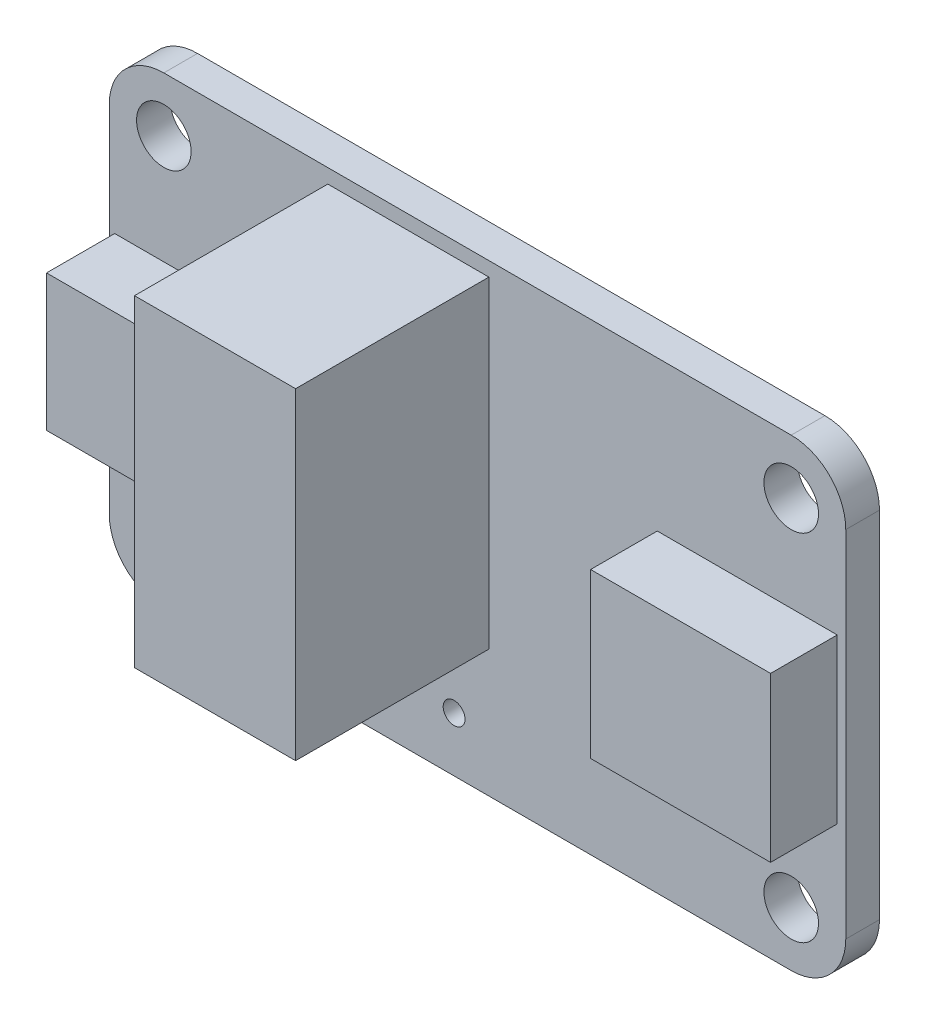
ISO-10303-21;
HEADER;
FILE_DESCRIPTION(('STEP AP214'),'2;1');
FILE_NAME('part.step','',(''),(''),'','','');
FILE_SCHEMA(('AUTOMOTIVE_DESIGN { 1 0 10303 214 1 1 1 1 }'));
ENDSEC;
DATA;
#1=APPLICATION_CONTEXT('core data for automotive mechanical design processes');
#2=APPLICATION_PROTOCOL_DEFINITION('international standard','automotive_design',2000,#1);
#3=PRODUCT_CONTEXT('',#1,'mechanical');
#4=PRODUCT('Part','Part','',(#3));
#5=PRODUCT_RELATED_PRODUCT_CATEGORY('part','',(#4));
#6=PRODUCT_DEFINITION_FORMATION('','',#4);
#7=PRODUCT_DEFINITION_CONTEXT('part definition',#1,'design');
#8=PRODUCT_DEFINITION('design','',#6,#7);
#9=PRODUCT_DEFINITION_SHAPE('','',#8);
#10=(LENGTH_UNIT() NAMED_UNIT(*) SI_UNIT(.MILLI.,.METRE.));
#11=(NAMED_UNIT(*) PLANE_ANGLE_UNIT() SI_UNIT($,.RADIAN.));
#12=(NAMED_UNIT(*) SI_UNIT($,.STERADIAN.) SOLID_ANGLE_UNIT());
#13=UNCERTAINTY_MEASURE_WITH_UNIT(LENGTH_MEASURE(1.E-05),#10,'distance_accuracy_value','');
#14=(GEOMETRIC_REPRESENTATION_CONTEXT(3) GLOBAL_UNCERTAINTY_ASSIGNED_CONTEXT((#13)) GLOBAL_UNIT_ASSIGNED_CONTEXT((#10,
#11,#12)) REPRESENTATION_CONTEXT('',''));
#15=CARTESIAN_POINT('',(0.,0.,0.));
#16=DIRECTION('',(0.,0.,1.));
#17=DIRECTION('',(1.,0.,0.));
#18=AXIS2_PLACEMENT_3D('',#15,#16,#17);
#19=CARTESIAN_POINT('',(0.,0.,1.5699994));
#20=DIRECTION('',(0.,0.,-1.));
#21=DIRECTION('',(-1.,0.,0.));
#22=AXIS2_PLACEMENT_3D('',#19,#20,#21);
#23=PLANE('',#22);
#24=DIRECTION('',(0.,1.,0.));
#25=VECTOR('',#24,1.);
#26=CARTESIAN_POINT('',(-12.192,3.175,1.5699994));
#27=LINE('',#26,#25);
#28=CARTESIAN_POINT('',(-12.192,-3.175,1.5699994));
#29=VERTEX_POINT('',#28);
#30=CARTESIAN_POINT('',(-12.192,3.175,1.5699994));
#31=VERTEX_POINT('',#30);
#32=EDGE_CURVE('E270',#29,#31,#27,.T.);
#33=ORIENTED_EDGE('',*,*,#32,.F.);
#34=DIRECTION('',(1.,0.,0.));
#35=VECTOR('',#34,1.);
#36=CARTESIAN_POINT('',(-16.891,-3.175,1.5699994));
#37=LINE('',#36,#35);
#38=CARTESIAN_POINT('',(-16.891,-3.175,1.5699994));
#39=VERTEX_POINT('',#38);
#40=EDGE_CURVE('E284',#39,#29,#37,.T.);
#41=ORIENTED_EDGE('',*,*,#40,.F.);
#42=DIRECTION('',(0.,-1.,0.));
#43=VECTOR('',#42,1.);
#44=CARTESIAN_POINT('',(-16.891,3.175,1.5699994));
#45=LINE('',#44,#43);
#46=CARTESIAN_POINT('',(-16.891,3.175,1.5699994));
#47=VERTEX_POINT('',#46);
#48=EDGE_CURVE('E301',#47,#39,#45,.T.);
#49=ORIENTED_EDGE('',*,*,#48,.F.);
#50=DIRECTION('',(-1.,0.,0.));
#51=VECTOR('',#50,1.);
#52=CARTESIAN_POINT('',(-16.891,3.175,1.5699994));
#53=LINE('',#52,#51);
#54=EDGE_CURVE('E297',#31,#47,#53,.T.);
#55=ORIENTED_EDGE('',*,*,#54,.F.);
#56=EDGE_LOOP('',(#33,#41,#49,#55));
#57=FACE_BOUND('',#56,.T.);
#58=CARTESIAN_POINT('',(-1.08979169383857,-8.255,1.5699994));
#59=DIRECTION('',(0.,0.,1.));
#60=DIRECTION('',(1.,0.,0.));
#61=AXIS2_PLACEMENT_3D('',#58,#59,#60);
#62=CIRCLE('',#61,0.508);
#63=CARTESIAN_POINT('',(-0.58179169383857,-8.255,1.5699994));
#64=VERTEX_POINT('',#63);
#65=EDGE_CURVE('E369',#64,#64,#62,.T.);
#66=ORIENTED_EDGE('',*,*,#65,.F.);
#67=EDGE_LOOP('',(#66));
#68=FACE_BOUND('',#67,.T.);
#69=CARTESIAN_POINT('',(-3.62979169383857,-8.255,1.5699994));
#70=DIRECTION('',(0.,0.,1.));
#71=DIRECTION('',(1.,0.,0.));
#72=AXIS2_PLACEMENT_3D('',#69,#70,#71);
#73=CIRCLE('',#72,0.508);
#74=CARTESIAN_POINT('',(-3.12179169383857,-8.255,1.5699994));
#75=VERTEX_POINT('',#74);
#76=EDGE_CURVE('E377',#75,#75,#73,.T.);
#77=ORIENTED_EDGE('',*,*,#76,.F.);
#78=EDGE_LOOP('',(#77));
#79=FACE_BOUND('',#78,.T.);
#80=CARTESIAN_POINT('',(-6.16979169383857,-8.255,1.5699994));
#81=DIRECTION('',(0.,0.,1.));
#82=DIRECTION('',(1.,0.,0.));
#83=AXIS2_PLACEMENT_3D('',#80,#81,#82);
#84=CIRCLE('',#83,0.508);
#85=CARTESIAN_POINT('',(-5.66179169383857,-8.255,1.5699994));
#86=VERTEX_POINT('',#85);
#87=EDGE_CURVE('E385',#86,#86,#84,.T.);
#88=ORIENTED_EDGE('',*,*,#87,.F.);
#89=EDGE_LOOP('',(#88));
#90=FACE_BOUND('',#89,.T.);
#91=CARTESIAN_POINT('',(14.605,8.255,1.5699994));
#92=DIRECTION('',(0.,0.,1.));
#93=DIRECTION('',(1.,0.,0.));
#94=AXIS2_PLACEMENT_3D('',#91,#92,#93);
#95=CIRCLE('',#94,1.27);
#96=CARTESIAN_POINT('',(15.875,8.255,1.5699994));
#97=VERTEX_POINT('',#96);
#98=EDGE_CURVE('E393',#97,#97,#95,.T.);
#99=ORIENTED_EDGE('',*,*,#98,.F.);
#100=EDGE_LOOP('',(#99));
#101=FACE_BOUND('',#100,.T.);
#102=CARTESIAN_POINT('',(14.605,-8.255,1.5699994));
#103=DIRECTION('',(0.,0.,1.));
#104=DIRECTION('',(1.,0.,0.));
#105=AXIS2_PLACEMENT_3D('',#102,#103,#104);
#106=CIRCLE('',#105,1.27);
#107=CARTESIAN_POINT('',(15.875,-8.255,1.5699994));
#108=VERTEX_POINT('',#107);
#109=EDGE_CURVE('E401',#108,#108,#106,.T.);
#110=ORIENTED_EDGE('',*,*,#109,.F.);
#111=EDGE_LOOP('',(#110));
#112=FACE_BOUND('',#111,.T.);
#113=CARTESIAN_POINT('',(-14.605,-8.255,1.5699994));
#114=DIRECTION('',(0.,0.,1.));
#115=DIRECTION('',(1.,0.,0.));
#116=AXIS2_PLACEMENT_3D('',#113,#114,#115);
#117=CIRCLE('',#116,1.27);
#118=CARTESIAN_POINT('',(-13.335,-8.255,1.5699994));
#119=VERTEX_POINT('',#118);
#120=EDGE_CURVE('E409',#119,#119,#117,.T.);
#121=ORIENTED_EDGE('',*,*,#120,.F.);
#122=EDGE_LOOP('',(#121));
#123=FACE_BOUND('',#122,.T.);
#124=CARTESIAN_POINT('',(-14.605,8.255,1.5699994));
#125=DIRECTION('',(0.,0.,1.));
#126=DIRECTION('',(1.,0.,0.));
#127=AXIS2_PLACEMENT_3D('',#124,#125,#126);
#128=CIRCLE('',#127,1.27);
#129=CARTESIAN_POINT('',(-13.335,8.255,1.5699994));
#130=VERTEX_POINT('',#129);
#131=EDGE_CURVE('E417',#130,#130,#128,.T.);
#132=ORIENTED_EDGE('',*,*,#131,.F.);
#133=EDGE_LOOP('',(#132));
#134=FACE_BOUND('',#133,.T.);
#135=DIRECTION('',(0.,1.,0.));
#136=VECTOR('',#135,1.);
#137=CARTESIAN_POINT('',(17.145,-10.795,1.5699994));
#138=LINE('',#137,#136);
#139=CARTESIAN_POINT('',(17.145,-8.255,1.5699994));
#140=VERTEX_POINT('',#139);
#141=CARTESIAN_POINT('',(17.145,8.255,1.5699994));
#142=VERTEX_POINT('',#141);
#143=EDGE_CURVE('E425',#140,#142,#138,.T.);
#144=ORIENTED_EDGE('',*,*,#143,.T.);
#145=CARTESIAN_POINT('',(14.605,8.255,1.5699994));
#146=DIRECTION('',(0.,0.,-1.));
#147=DIRECTION('',(-1.,0.,0.));
#148=AXIS2_PLACEMENT_3D('',#145,#146,#147);
#149=CIRCLE('',#148,2.54);
#150=CARTESIAN_POINT('',(14.605,10.795,1.5699994));
#151=VERTEX_POINT('',#150);
#152=EDGE_CURVE('E491',#142,#151,#149,.F.);
#153=ORIENTED_EDGE('',*,*,#152,.T.);
#154=DIRECTION('',(-1.,0.,0.));
#155=VECTOR('',#154,1.);
#156=CARTESIAN_POINT('',(-17.145,10.795,1.5699994));
#157=LINE('',#156,#155);
#158=CARTESIAN_POINT('',(-14.605,10.795,1.5699994));
#159=VERTEX_POINT('',#158);
#160=EDGE_CURVE('E429',#151,#159,#157,.T.);
#161=ORIENTED_EDGE('',*,*,#160,.T.);
#162=CARTESIAN_POINT('',(-14.605,8.255,1.5699994));
#163=DIRECTION('',(0.,0.,-1.));
#164=DIRECTION('',(-1.,0.,0.));
#165=AXIS2_PLACEMENT_3D('',#162,#163,#164);
#166=CIRCLE('',#165,2.54);
#167=CARTESIAN_POINT('',(-17.145,8.255,1.5699994));
#168=VERTEX_POINT('',#167);
#169=EDGE_CURVE('E482',#159,#168,#166,.F.);
#170=ORIENTED_EDGE('',*,*,#169,.T.);
#171=DIRECTION('',(0.,-1.,0.));
#172=VECTOR('',#171,1.);
#173=CARTESIAN_POINT('',(-17.145,-10.795,1.5699994));
#174=LINE('',#173,#172);
#175=CARTESIAN_POINT('',(-17.145,-8.255,1.5699994));
#176=VERTEX_POINT('',#175);
#177=EDGE_CURVE('E434',#168,#176,#174,.T.);
#178=ORIENTED_EDGE('',*,*,#177,.T.);
#179=CARTESIAN_POINT('',(-14.605,-8.255,1.5699994));
#180=DIRECTION('',(0.,0.,-1.));
#181=DIRECTION('',(-1.,0.,0.));
#182=AXIS2_PLACEMENT_3D('',#179,#180,#181);
#183=CIRCLE('',#182,2.54);
#184=CARTESIAN_POINT('',(-14.605,-10.795,1.5699994));
#185=VERTEX_POINT('',#184);
#186=EDGE_CURVE('E485',#176,#185,#183,.F.);
#187=ORIENTED_EDGE('',*,*,#186,.T.);
#188=DIRECTION('',(1.,0.,0.));
#189=VECTOR('',#188,1.);
#190=CARTESIAN_POINT('',(-17.145,-10.795,1.5699994));
#191=LINE('',#190,#189);
#192=CARTESIAN_POINT('',(14.605,-10.795,1.5699994));
#193=VERTEX_POINT('',#192);
#194=EDGE_CURVE('E438',#185,#193,#191,.T.);
#195=ORIENTED_EDGE('',*,*,#194,.T.);
#196=CARTESIAN_POINT('',(14.605,-8.255,1.5699994));
#197=DIRECTION('',(0.,0.,-1.));
#198=DIRECTION('',(-1.,0.,0.));
#199=AXIS2_PLACEMENT_3D('',#196,#197,#198);
#200=CIRCLE('',#199,2.54);
#201=EDGE_CURVE('E488',#193,#140,#200,.F.);
#202=ORIENTED_EDGE('',*,*,#201,.T.);
#203=EDGE_LOOP('',(#144,#153,#161,#170,#178,#187,#195,#202));
#204=FACE_BOUND('',#203,.T.);
#205=DIRECTION('',(0.,1.,0.));
#206=VECTOR('',#205,1.);
#207=CARTESIAN_POINT('',(0.530301049091974,10.1297954286495,1.5699994));
#208=LINE('',#207,#206);
#209=CARTESIAN_POINT('',(0.530301049091976,-4.87020457135051,1.5699994));
#210=VERTEX_POINT('',#209);
#211=CARTESIAN_POINT('',(0.530301049091974,10.1297954286495,1.5699994));
#212=VERTEX_POINT('',#211);
#213=EDGE_CURVE('E323',#210,#212,#208,.T.);
#214=ORIENTED_EDGE('',*,*,#213,.F.);
#215=DIRECTION('',(1.,0.,0.));
#216=VECTOR('',#215,1.);
#217=CARTESIAN_POINT('',(-6.96969895090802,-4.87020457135051,1.5699994));
#218=LINE('',#217,#216);
#219=CARTESIAN_POINT('',(-6.96969895090802,-4.87020457135051,1.5699994));
#220=VERTEX_POINT('',#219);
#221=EDGE_CURVE('E329',#220,#210,#218,.T.);
#222=ORIENTED_EDGE('',*,*,#221,.F.);
#223=DIRECTION('',(0.,-1.,0.));
#224=VECTOR('',#223,1.);
#225=CARTESIAN_POINT('',(-6.96969895090803,10.1297954286495,1.5699994));
#226=LINE('',#225,#224);
#227=CARTESIAN_POINT('',(-6.96969895090803,10.1297954286495,1.5699994));
#228=VERTEX_POINT('',#227);
#229=EDGE_CURVE('E346',#228,#220,#226,.T.);
#230=ORIENTED_EDGE('',*,*,#229,.F.);
#231=DIRECTION('',(-1.,0.,0.));
#232=VECTOR('',#231,1.);
#233=CARTESIAN_POINT('',(-6.96969895090803,10.1297954286495,1.5699994));
#234=LINE('',#233,#232);
#235=EDGE_CURVE('E342',#212,#228,#234,.T.);
#236=ORIENTED_EDGE('',*,*,#235,.F.);
#237=EDGE_LOOP('',(#214,#222,#230,#236));
#238=FACE_BOUND('',#237,.T.);
#239=DIRECTION('',(-1.,0.,0.));
#240=VECTOR('',#239,1.);
#241=CARTESIAN_POINT('',(8.36863494105447,3.81,1.5699994));
#242=LINE('',#241,#240);
#243=CARTESIAN_POINT('',(16.7473828153627,3.81,1.5699994));
#244=VERTEX_POINT('',#243);
#245=CARTESIAN_POINT('',(8.36863494105447,3.81,1.5699994));
#246=VERTEX_POINT('',#245);
#247=EDGE_CURVE('E222',#244,#246,#242,.T.);
#248=ORIENTED_EDGE('',*,*,#247,.F.);
#249=DIRECTION('',(0.,-1.,0.));
#250=VECTOR('',#249,1.);
#251=CARTESIAN_POINT('',(16.7473828153627,3.81,1.5699994));
#252=LINE('',#251,#250);
#253=CARTESIAN_POINT('',(16.7473828153627,-3.81,1.5699994));
#254=VERTEX_POINT('',#253);
#255=EDGE_CURVE('E235',#244,#254,#252,.T.);
#256=ORIENTED_EDGE('',*,*,#255,.T.);
#257=DIRECTION('',(-1.,0.,0.));
#258=VECTOR('',#257,1.);
#259=CARTESIAN_POINT('',(8.36863494105447,-3.81,1.5699994));
#260=LINE('',#259,#258);
#261=CARTESIAN_POINT('',(8.36863494105447,-3.81,1.5699994));
#262=VERTEX_POINT('',#261);
#263=EDGE_CURVE('E226',#254,#262,#260,.T.);
#264=ORIENTED_EDGE('',*,*,#263,.T.);
#265=DIRECTION('',(0.,-1.,0.));
#266=VECTOR('',#265,1.);
#267=CARTESIAN_POINT('',(8.36863494105447,3.81,1.5699994));
#268=LINE('',#267,#266);
#269=EDGE_CURVE('E1001',#246,#262,#268,.T.);
#270=ORIENTED_EDGE('',*,*,#269,.F.);
#271=EDGE_LOOP('',(#248,#256,#264,#270));
#272=FACE_BOUND('',#271,.T.);
#273=ADVANCED_FACE('F44',(#57,#68,#79,#90,#101,#112,#123,#134,#204,#238,#272),#23,.F.);
#274=CARTESIAN_POINT('',(0.,0.,0.));
#275=DIRECTION('',(0.,0.,-1.));
#276=DIRECTION('',(-1.,0.,0.));
#277=AXIS2_PLACEMENT_3D('',#274,#275,#276);
#278=PLANE('',#277);
#279=CARTESIAN_POINT('',(-3.62979169383857,-8.255,0.));
#280=DIRECTION('',(0.,0.,1.));
#281=DIRECTION('',(1.,0.,0.));
#282=AXIS2_PLACEMENT_3D('',#279,#280,#281);
#283=CIRCLE('',#282,0.508);
#284=CARTESIAN_POINT('',(-3.12179169383857,-8.255,0.));
#285=VERTEX_POINT('',#284);
#286=EDGE_CURVE('E373',#285,#285,#283,.T.);
#287=ORIENTED_EDGE('',*,*,#286,.T.);
#288=EDGE_LOOP('',(#287));
#289=FACE_BOUND('',#288,.T.);
#290=CARTESIAN_POINT('',(14.605,8.255,0.));
#291=DIRECTION('',(0.,0.,1.));
#292=DIRECTION('',(1.,0.,0.));
#293=AXIS2_PLACEMENT_3D('',#290,#291,#292);
#294=CIRCLE('',#293,1.27);
#295=CARTESIAN_POINT('',(15.875,8.255,0.));
#296=VERTEX_POINT('',#295);
#297=EDGE_CURVE('E389',#296,#296,#294,.T.);
#298=ORIENTED_EDGE('',*,*,#297,.T.);
#299=EDGE_LOOP('',(#298));
#300=FACE_BOUND('',#299,.T.);
#301=CARTESIAN_POINT('',(-14.605,-8.255,0.));
#302=DIRECTION('',(0.,0.,1.));
#303=DIRECTION('',(1.,0.,0.));
#304=AXIS2_PLACEMENT_3D('',#301,#302,#303);
#305=CIRCLE('',#304,1.27);
#306=CARTESIAN_POINT('',(-13.335,-8.255,0.));
#307=VERTEX_POINT('',#306);
#308=EDGE_CURVE('E405',#307,#307,#305,.T.);
#309=ORIENTED_EDGE('',*,*,#308,.T.);
#310=EDGE_LOOP('',(#309));
#311=FACE_BOUND('',#310,.T.);
#312=DIRECTION('',(-1.,0.,0.));
#313=VECTOR('',#312,1.);
#314=CARTESIAN_POINT('',(-17.145,10.795,0.));
#315=LINE('',#314,#313);
#316=CARTESIAN_POINT('',(14.605,10.795,0.));
#317=VERTEX_POINT('',#316);
#318=CARTESIAN_POINT('',(-14.605,10.795,0.));
#319=VERTEX_POINT('',#318);
#320=EDGE_CURVE('E446',#317,#319,#315,.T.);
#321=ORIENTED_EDGE('',*,*,#320,.F.);
#322=CARTESIAN_POINT('',(14.605,8.255,0.));
#323=DIRECTION('',(0.,0.,-1.));
#324=DIRECTION('',(-1.,0.,0.));
#325=AXIS2_PLACEMENT_3D('',#322,#323,#324);
#326=CIRCLE('',#325,2.54);
#327=CARTESIAN_POINT('',(17.145,8.255,0.));
#328=VERTEX_POINT('',#327);
#329=EDGE_CURVE('E472',#317,#328,#326,.T.);
#330=ORIENTED_EDGE('',*,*,#329,.T.);
#331=DIRECTION('',(0.,1.,0.));
#332=VECTOR('',#331,1.);
#333=CARTESIAN_POINT('',(17.145,-10.795,0.));
#334=LINE('',#333,#332);
#335=CARTESIAN_POINT('',(17.145,-8.255,0.));
#336=VERTEX_POINT('',#335);
#337=EDGE_CURVE('E421',#336,#328,#334,.T.);
#338=ORIENTED_EDGE('',*,*,#337,.F.);
#339=CARTESIAN_POINT('',(14.605,-8.255,0.));
#340=DIRECTION('',(0.,0.,-1.));
#341=DIRECTION('',(-1.,0.,0.));
#342=AXIS2_PLACEMENT_3D('',#339,#340,#341);
#343=CIRCLE('',#342,2.54);
#344=CARTESIAN_POINT('',(14.605,-10.795,0.));
#345=VERTEX_POINT('',#344);
#346=EDGE_CURVE('E469',#336,#345,#343,.T.);
#347=ORIENTED_EDGE('',*,*,#346,.T.);
#348=DIRECTION('',(1.,0.,0.));
#349=VECTOR('',#348,1.);
#350=CARTESIAN_POINT('',(-17.145,-10.795,0.));
#351=LINE('',#350,#349);
#352=CARTESIAN_POINT('',(-14.605,-10.795,0.));
#353=VERTEX_POINT('',#352);
#354=EDGE_CURVE('E430',#353,#345,#351,.T.);
#355=ORIENTED_EDGE('',*,*,#354,.F.);
#356=CARTESIAN_POINT('',(-14.605,-8.255,0.));
#357=DIRECTION('',(0.,0.,-1.));
#358=DIRECTION('',(-1.,0.,0.));
#359=AXIS2_PLACEMENT_3D('',#356,#357,#358);
#360=CIRCLE('',#359,2.54);
#361=CARTESIAN_POINT('',(-17.145,-8.255,0.));
#362=VERTEX_POINT('',#361);
#363=EDGE_CURVE('E466',#353,#362,#360,.T.);
#364=ORIENTED_EDGE('',*,*,#363,.T.);
#365=DIRECTION('',(0.,-1.,0.));
#366=VECTOR('',#365,1.);
#367=CARTESIAN_POINT('',(-17.145,-10.795,0.));
#368=LINE('',#367,#366);
#369=CARTESIAN_POINT('',(-17.145,8.255,0.));
#370=VERTEX_POINT('',#369);
#371=EDGE_CURVE('E450',#370,#362,#368,.T.);
#372=ORIENTED_EDGE('',*,*,#371,.F.);
#373=CARTESIAN_POINT('',(-14.605,8.255,0.));
#374=DIRECTION('',(0.,0.,-1.));
#375=DIRECTION('',(-1.,0.,0.));
#376=AXIS2_PLACEMENT_3D('',#373,#374,#375);
#377=CIRCLE('',#376,2.54);
#378=EDGE_CURVE('E463',#370,#319,#377,.T.);
#379=ORIENTED_EDGE('',*,*,#378,.T.);
#380=EDGE_LOOP('',(#321,#330,#338,#347,#355,#364,#372,#379));
#381=FACE_BOUND('',#380,.T.);
#382=CARTESIAN_POINT('',(-14.605,8.255,0.));
#383=DIRECTION('',(0.,0.,1.));
#384=DIRECTION('',(1.,0.,0.));
#385=AXIS2_PLACEMENT_3D('',#382,#383,#384);
#386=CIRCLE('',#385,1.27);
#387=CARTESIAN_POINT('',(-13.335,8.255,0.));
#388=VERTEX_POINT('',#387);
#389=EDGE_CURVE('E413',#388,#388,#386,.T.);
#390=ORIENTED_EDGE('',*,*,#389,.T.);
#391=EDGE_LOOP('',(#390));
#392=FACE_BOUND('',#391,.T.);
#393=CARTESIAN_POINT('',(14.605,-8.255,0.));
#394=DIRECTION('',(0.,0.,1.));
#395=DIRECTION('',(1.,0.,0.));
#396=AXIS2_PLACEMENT_3D('',#393,#394,#395);
#397=CIRCLE('',#396,1.27);
#398=CARTESIAN_POINT('',(15.875,-8.255,0.));
#399=VERTEX_POINT('',#398);
#400=EDGE_CURVE('E397',#399,#399,#397,.T.);
#401=ORIENTED_EDGE('',*,*,#400,.T.);
#402=EDGE_LOOP('',(#401));
#403=FACE_BOUND('',#402,.T.);
#404=CARTESIAN_POINT('',(-6.16979169383857,-8.255,0.));
#405=DIRECTION('',(0.,0.,1.));
#406=DIRECTION('',(1.,0.,0.));
#407=AXIS2_PLACEMENT_3D('',#404,#405,#406);
#408=CIRCLE('',#407,0.508);
#409=CARTESIAN_POINT('',(-5.66179169383857,-8.255,0.));
#410=VERTEX_POINT('',#409);
#411=EDGE_CURVE('E381',#410,#410,#408,.T.);
#412=ORIENTED_EDGE('',*,*,#411,.T.);
#413=EDGE_LOOP('',(#412));
#414=FACE_BOUND('',#413,.T.);
#415=CARTESIAN_POINT('',(-1.08979169383857,-8.255,0.));
#416=DIRECTION('',(0.,0.,1.));
#417=DIRECTION('',(1.,0.,0.));
#418=AXIS2_PLACEMENT_3D('',#415,#416,#417);
#419=CIRCLE('',#418,0.508);
#420=CARTESIAN_POINT('',(-0.58179169383857,-8.255,0.));
#421=VERTEX_POINT('',#420);
#422=EDGE_CURVE('E368',#421,#421,#419,.T.);
#423=ORIENTED_EDGE('',*,*,#422,.T.);
#424=EDGE_LOOP('',(#423));
#425=FACE_BOUND('',#424,.T.);
#426=ADVANCED_FACE('F512',(#289,#300,#311,#381,#392,#403,#414,#425),#278,.T.);
#427=CARTESIAN_POINT('',(17.145,-10.795,1.5699994));
#428=DIRECTION('',(-1.,0.,0.));
#429=DIRECTION('',(0.,0.,1.));
#430=AXIS2_PLACEMENT_3D('',#427,#428,#429);
#431=PLANE('',#430);
#432=ORIENTED_EDGE('',*,*,#337,.T.);
#433=DIRECTION('',(0.,0.,-1.));
#434=VECTOR('',#433,1.);
#435=CARTESIAN_POINT('',(17.145,8.255,1.5699994));
#436=LINE('',#435,#434);
#437=EDGE_CURVE('E479',#328,#142,#436,.F.);
#438=ORIENTED_EDGE('',*,*,#437,.T.);
#439=ORIENTED_EDGE('',*,*,#143,.F.);
#440=DIRECTION('',(0.,0.,-1.));
#441=VECTOR('',#440,1.);
#442=CARTESIAN_POINT('',(17.145,-8.255,1.5699994));
#443=LINE('',#442,#441);
#444=EDGE_CURVE('E475',#140,#336,#443,.T.);
#445=ORIENTED_EDGE('',*,*,#444,.T.);
#446=EDGE_LOOP('',(#432,#438,#439,#445));
#447=FACE_BOUND('',#446,.T.);
#448=ADVANCED_FACE('F532',(#447),#431,.F.);
#449=CARTESIAN_POINT('',(-17.145,10.795,1.5699994));
#450=DIRECTION('',(0.,-1.,0.));
#451=DIRECTION('',(0.,0.,-1.));
#452=AXIS2_PLACEMENT_3D('',#449,#450,#451);
#453=PLANE('',#452);
#454=ORIENTED_EDGE('',*,*,#160,.F.);
#455=DIRECTION('',(0.,0.,-1.));
#456=VECTOR('',#455,1.);
#457=CARTESIAN_POINT('',(14.605,10.795,1.5699994));
#458=LINE('',#457,#456);
#459=EDGE_CURVE('E459',#151,#317,#458,.T.);
#460=ORIENTED_EDGE('',*,*,#459,.T.);
#461=ORIENTED_EDGE('',*,*,#320,.T.);
#462=DIRECTION('',(0.,0.,-1.));
#463=VECTOR('',#462,1.);
#464=CARTESIAN_POINT('',(-14.605,10.795,1.5699994));
#465=LINE('',#464,#463);
#466=EDGE_CURVE('E442',#319,#159,#465,.F.);
#467=ORIENTED_EDGE('',*,*,#466,.T.);
#468=EDGE_LOOP('',(#454,#460,#461,#467));
#469=FACE_BOUND('',#468,.T.);
#470=ADVANCED_FACE('F540',(#469),#453,.F.);
#471=CARTESIAN_POINT('',(-17.145,-10.795,1.5699994));
#472=DIRECTION('',(1.,0.,0.));
#473=DIRECTION('',(0.,0.,-1.));
#474=AXIS2_PLACEMENT_3D('',#471,#472,#473);
#475=PLANE('',#474);
#476=ORIENTED_EDGE('',*,*,#371,.T.);
#477=DIRECTION('',(0.,0.,-1.));
#478=VECTOR('',#477,1.);
#479=CARTESIAN_POINT('',(-17.145,-8.255,1.5699994));
#480=LINE('',#479,#478);
#481=EDGE_CURVE('E11',#362,#176,#480,.F.);
#482=ORIENTED_EDGE('',*,*,#481,.T.);
#483=ORIENTED_EDGE('',*,*,#177,.F.);
#484=DIRECTION('',(0.,0.,-1.));
#485=VECTOR('',#484,1.);
#486=CARTESIAN_POINT('',(-17.145,8.255,1.5699994));
#487=LINE('',#486,#485);
#488=EDGE_CURVE('E53',#168,#370,#487,.T.);
#489=ORIENTED_EDGE('',*,*,#488,.T.);
#490=EDGE_LOOP('',(#476,#482,#483,#489));
#491=FACE_BOUND('',#490,.T.);
#492=ADVANCED_FACE('F506',(#491),#475,.F.);
#493=CARTESIAN_POINT('',(-17.145,-10.795,1.5699994));
#494=DIRECTION('',(0.,1.,0.));
#495=DIRECTION('',(0.,0.,1.));
#496=AXIS2_PLACEMENT_3D('',#493,#494,#495);
#497=PLANE('',#496);
#498=ORIENTED_EDGE('',*,*,#354,.T.);
#499=DIRECTION('',(0.,0.,-1.));
#500=VECTOR('',#499,1.);
#501=CARTESIAN_POINT('',(14.605,-10.795,1.5699994));
#502=LINE('',#501,#500);
#503=EDGE_CURVE('E498',#345,#193,#502,.F.);
#504=ORIENTED_EDGE('',*,*,#503,.T.);
#505=ORIENTED_EDGE('',*,*,#194,.F.);
#506=DIRECTION('',(0.,0.,-1.));
#507=VECTOR('',#506,1.);
#508=CARTESIAN_POINT('',(-14.605,-10.795,1.5699994));
#509=LINE('',#508,#507);
#510=EDGE_CURVE('E494',#185,#353,#509,.T.);
#511=ORIENTED_EDGE('',*,*,#510,.T.);
#512=EDGE_LOOP('',(#498,#504,#505,#511));
#513=FACE_BOUND('',#512,.T.);
#514=ADVANCED_FACE('F521',(#513),#497,.F.);
#515=CARTESIAN_POINT('',(-14.605,8.255,1.5699994));
#516=DIRECTION('',(0.,0.,-1.));
#517=DIRECTION('',(-1.,0.,0.));
#518=AXIS2_PLACEMENT_3D('',#515,#516,#517);
#519=CYLINDRICAL_SURFACE('',#518,1.27);
#520=ORIENTED_EDGE('',*,*,#131,.T.);
#521=EDGE_LOOP('',(#520));
#522=FACE_BOUND('',#521,.T.);
#523=ORIENTED_EDGE('',*,*,#389,.F.);
#524=EDGE_LOOP('',(#523));
#525=FACE_BOUND('',#524,.T.);
#526=ADVANCED_FACE('F561',(#522,#525),#519,.F.);
#527=CARTESIAN_POINT('',(-14.605,-8.255,1.5699994));
#528=DIRECTION('',(0.,0.,-1.));
#529=DIRECTION('',(-1.,0.,0.));
#530=AXIS2_PLACEMENT_3D('',#527,#528,#529);
#531=CYLINDRICAL_SURFACE('',#530,1.27);
#532=ORIENTED_EDGE('',*,*,#120,.T.);
#533=EDGE_LOOP('',(#532));
#534=FACE_BOUND('',#533,.T.);
#535=ORIENTED_EDGE('',*,*,#308,.F.);
#536=EDGE_LOOP('',(#535));
#537=FACE_BOUND('',#536,.T.);
#538=ADVANCED_FACE('F828',(#534,#537),#531,.F.);
#539=CARTESIAN_POINT('',(14.605,-8.255,1.5699994));
#540=DIRECTION('',(0.,0.,-1.));
#541=DIRECTION('',(-1.,0.,0.));
#542=AXIS2_PLACEMENT_3D('',#539,#540,#541);
#543=CYLINDRICAL_SURFACE('',#542,1.27);
#544=ORIENTED_EDGE('',*,*,#109,.T.);
#545=EDGE_LOOP('',(#544));
#546=FACE_BOUND('',#545,.T.);
#547=ORIENTED_EDGE('',*,*,#400,.F.);
#548=EDGE_LOOP('',(#547));
#549=FACE_BOUND('',#548,.T.);
#550=ADVANCED_FACE('F825',(#546,#549),#543,.F.);
#551=CARTESIAN_POINT('',(14.605,8.255,1.5699994));
#552=DIRECTION('',(0.,0.,-1.));
#553=DIRECTION('',(-1.,0.,0.));
#554=AXIS2_PLACEMENT_3D('',#551,#552,#553);
#555=CYLINDRICAL_SURFACE('',#554,1.27);
#556=ORIENTED_EDGE('',*,*,#98,.T.);
#557=EDGE_LOOP('',(#556));
#558=FACE_BOUND('',#557,.T.);
#559=ORIENTED_EDGE('',*,*,#297,.F.);
#560=EDGE_LOOP('',(#559));
#561=FACE_BOUND('',#560,.T.);
#562=ADVANCED_FACE('F821',(#558,#561),#555,.F.);
#563=CARTESIAN_POINT('',(-6.16979169383857,-8.255,1.5699994));
#564=DIRECTION('',(0.,0.,-1.));
#565=DIRECTION('',(-1.,0.,0.));
#566=AXIS2_PLACEMENT_3D('',#563,#564,#565);
#567=CYLINDRICAL_SURFACE('',#566,0.508);
#568=ORIENTED_EDGE('',*,*,#87,.T.);
#569=EDGE_LOOP('',(#568));
#570=FACE_BOUND('',#569,.T.);
#571=ORIENTED_EDGE('',*,*,#411,.F.);
#572=EDGE_LOOP('',(#571));
#573=FACE_BOUND('',#572,.T.);
#574=ADVANCED_FACE('F817',(#570,#573),#567,.F.);
#575=CARTESIAN_POINT('',(-3.62979169383857,-8.255,1.5699994));
#576=DIRECTION('',(0.,0.,-1.));
#577=DIRECTION('',(-1.,0.,0.));
#578=AXIS2_PLACEMENT_3D('',#575,#576,#577);
#579=CYLINDRICAL_SURFACE('',#578,0.508);
#580=ORIENTED_EDGE('',*,*,#76,.T.);
#581=EDGE_LOOP('',(#580));
#582=FACE_BOUND('',#581,.T.);
#583=ORIENTED_EDGE('',*,*,#286,.F.);
#584=EDGE_LOOP('',(#583));
#585=FACE_BOUND('',#584,.T.);
#586=ADVANCED_FACE('F813',(#582,#585),#579,.F.);
#587=CARTESIAN_POINT('',(-1.08979169383857,-8.255,1.5699994));
#588=DIRECTION('',(0.,0.,-1.));
#589=DIRECTION('',(-1.,0.,0.));
#590=AXIS2_PLACEMENT_3D('',#587,#588,#589);
#591=CYLINDRICAL_SURFACE('',#590,0.508);
#592=ORIENTED_EDGE('',*,*,#65,.T.);
#593=EDGE_LOOP('',(#592));
#594=FACE_BOUND('',#593,.T.);
#595=ORIENTED_EDGE('',*,*,#422,.F.);
#596=EDGE_LOOP('',(#595));
#597=FACE_BOUND('',#596,.T.);
#598=ADVANCED_FACE('F574',(#594,#597),#591,.F.);
#599=CARTESIAN_POINT('',(14.605,8.255,1.5699994));
#600=DIRECTION('',(0.,0.,-1.));
#601=DIRECTION('',(-1.,0.,0.));
#602=AXIS2_PLACEMENT_3D('',#599,#600,#601);
#603=CYLINDRICAL_SURFACE('',#602,2.54);
#604=ORIENTED_EDGE('',*,*,#152,.F.);
#605=ORIENTED_EDGE('',*,*,#437,.F.);
#606=ORIENTED_EDGE('',*,*,#329,.F.);
#607=ORIENTED_EDGE('',*,*,#459,.F.);
#608=EDGE_LOOP('',(#604,#605,#606,#607));
#609=FACE_BOUND('',#608,.T.);
#610=ADVANCED_FACE('F537',(#609),#603,.T.);
#611=CARTESIAN_POINT('',(14.605,-8.255,1.5699994));
#612=DIRECTION('',(0.,0.,-1.));
#613=DIRECTION('',(-1.,0.,0.));
#614=AXIS2_PLACEMENT_3D('',#611,#612,#613);
#615=CYLINDRICAL_SURFACE('',#614,2.54);
#616=ORIENTED_EDGE('',*,*,#201,.F.);
#617=ORIENTED_EDGE('',*,*,#503,.F.);
#618=ORIENTED_EDGE('',*,*,#346,.F.);
#619=ORIENTED_EDGE('',*,*,#444,.F.);
#620=EDGE_LOOP('',(#616,#617,#618,#619));
#621=FACE_BOUND('',#620,.T.);
#622=ADVANCED_FACE('F529',(#621),#615,.T.);
#623=CARTESIAN_POINT('',(-14.605,-8.255,1.5699994));
#624=DIRECTION('',(0.,0.,-1.));
#625=DIRECTION('',(-1.,0.,0.));
#626=AXIS2_PLACEMENT_3D('',#623,#624,#625);
#627=CYLINDRICAL_SURFACE('',#626,2.54);
#628=ORIENTED_EDGE('',*,*,#186,.F.);
#629=ORIENTED_EDGE('',*,*,#481,.F.);
#630=ORIENTED_EDGE('',*,*,#363,.F.);
#631=ORIENTED_EDGE('',*,*,#510,.F.);
#632=EDGE_LOOP('',(#628,#629,#630,#631));
#633=FACE_BOUND('',#632,.T.);
#634=ADVANCED_FACE('F518',(#633),#627,.T.);
#635=CARTESIAN_POINT('',(-14.605,8.255,1.5699994));
#636=DIRECTION('',(0.,0.,-1.));
#637=DIRECTION('',(-1.,0.,0.));
#638=AXIS2_PLACEMENT_3D('',#635,#636,#637);
#639=CYLINDRICAL_SURFACE('',#638,2.54);
#640=ORIENTED_EDGE('',*,*,#169,.F.);
#641=ORIENTED_EDGE('',*,*,#466,.F.);
#642=ORIENTED_EDGE('',*,*,#378,.F.);
#643=ORIENTED_EDGE('',*,*,#488,.F.);
#644=EDGE_LOOP('',(#640,#641,#642,#643));
#645=FACE_BOUND('',#644,.T.);
#646=ADVANCED_FACE('F46',(#645),#639,.T.);
#647=CARTESIAN_POINT('',(0.530301049091974,10.1297954286495,10.5699994));
#648=DIRECTION('',(-1.,0.,0.));
#649=DIRECTION('',(0.,-1.,0.));
#650=AXIS2_PLACEMENT_3D('',#647,#648,#649);
#651=PLANE('',#650);
#652=ORIENTED_EDGE('',*,*,#213,.T.);
#653=DIRECTION('',(0.,0.,-1.));
#654=VECTOR('',#653,1.);
#655=CARTESIAN_POINT('',(0.530301049091974,10.1297954286495,10.5699994));
#656=LINE('',#655,#654);
#657=CARTESIAN_POINT('',(0.530301049091974,10.1297954286495,10.5699994));
#658=VERTEX_POINT('',#657);
#659=EDGE_CURVE('E364',#658,#212,#656,.T.);
#660=ORIENTED_EDGE('',*,*,#659,.F.);
#661=DIRECTION('',(0.,1.,0.));
#662=VECTOR('',#661,1.);
#663=CARTESIAN_POINT('',(0.530301049091974,10.1297954286495,10.5699994));
#664=LINE('',#663,#662);
#665=CARTESIAN_POINT('',(0.530301049091976,-4.87020457135051,10.5699994));
#666=VERTEX_POINT('',#665);
#667=EDGE_CURVE('E324',#666,#658,#664,.T.);
#668=ORIENTED_EDGE('',*,*,#667,.F.);
#669=DIRECTION('',(0.,0.,-1.));
#670=VECTOR('',#669,1.);
#671=CARTESIAN_POINT('',(0.530301049091976,-4.87020457135051,10.5699994));
#672=LINE('',#671,#670);
#673=EDGE_CURVE('E338',#666,#210,#672,.T.);
#674=ORIENTED_EDGE('',*,*,#673,.T.);
#675=EDGE_LOOP('',(#652,#660,#668,#674));
#676=FACE_BOUND('',#675,.T.);
#677=ADVANCED_FACE('F543',(#676),#651,.F.);
#678=CARTESIAN_POINT('',(-6.96969895090803,10.1297954286495,10.5699994));
#679=DIRECTION('',(0.,-1.,0.));
#680=DIRECTION('',(0.,0.,-1.));
#681=AXIS2_PLACEMENT_3D('',#678,#679,#680);
#682=PLANE('',#681);
#683=ORIENTED_EDGE('',*,*,#235,.T.);
#684=DIRECTION('',(0.,0.,-1.));
#685=VECTOR('',#684,1.);
#686=CARTESIAN_POINT('',(-6.96969895090803,10.1297954286495,10.5699994));
#687=LINE('',#686,#685);
#688=CARTESIAN_POINT('',(-6.96969895090803,10.1297954286495,10.5699994));
#689=VERTEX_POINT('',#688);
#690=EDGE_CURVE('E360',#689,#228,#687,.T.);
#691=ORIENTED_EDGE('',*,*,#690,.F.);
#692=DIRECTION('',(-1.,0.,0.));
#693=VECTOR('',#692,1.);
#694=CARTESIAN_POINT('',(-6.96969895090803,10.1297954286495,10.5699994));
#695=LINE('',#694,#693);
#696=EDGE_CURVE('E328',#658,#689,#695,.T.);
#697=ORIENTED_EDGE('',*,*,#696,.F.);
#698=ORIENTED_EDGE('',*,*,#659,.T.);
#699=EDGE_LOOP('',(#683,#691,#697,#698));
#700=FACE_BOUND('',#699,.T.);
#701=ADVANCED_FACE('F548',(#700),#682,.F.);
#702=CARTESIAN_POINT('',(-6.96969895090803,10.1297954286495,10.5699994));
#703=DIRECTION('',(1.,0.,0.));
#704=DIRECTION('',(0.,1.,0.));
#705=AXIS2_PLACEMENT_3D('',#702,#703,#704);
#706=PLANE('',#705);
#707=ORIENTED_EDGE('',*,*,#229,.T.);
#708=DIRECTION('',(0.,0.,-1.));
#709=VECTOR('',#708,1.);
#710=CARTESIAN_POINT('',(-6.96969895090802,-4.87020457135051,10.5699994));
#711=LINE('',#710,#709);
#712=CARTESIAN_POINT('',(-6.96969895090802,-4.87020457135051,10.5699994));
#713=VERTEX_POINT('',#712);
#714=EDGE_CURVE('E356',#713,#220,#711,.T.);
#715=ORIENTED_EDGE('',*,*,#714,.F.);
#716=DIRECTION('',(0.,-1.,0.));
#717=VECTOR('',#716,1.);
#718=CARTESIAN_POINT('',(-6.96969895090803,10.1297954286495,10.5699994));
#719=LINE('',#718,#717);
#720=EDGE_CURVE('E332',#689,#713,#719,.T.);
#721=ORIENTED_EDGE('',*,*,#720,.F.);
#722=ORIENTED_EDGE('',*,*,#690,.T.);
#723=EDGE_LOOP('',(#707,#715,#721,#722));
#724=FACE_BOUND('',#723,.T.);
#725=ADVANCED_FACE('F607',(#724),#706,.F.);
#726=CARTESIAN_POINT('',(-6.96969895090802,-4.87020457135051,10.5699994));
#727=DIRECTION('',(0.,1.,0.));
#728=DIRECTION('',(0.,0.,1.));
#729=AXIS2_PLACEMENT_3D('',#726,#727,#728);
#730=PLANE('',#729);
#731=ORIENTED_EDGE('',*,*,#221,.T.);
#732=ORIENTED_EDGE('',*,*,#673,.F.);
#733=DIRECTION('',(1.,0.,0.));
#734=VECTOR('',#733,1.);
#735=CARTESIAN_POINT('',(-6.96969895090802,-4.87020457135051,10.5699994));
#736=LINE('',#735,#734);
#737=EDGE_CURVE('E335',#713,#666,#736,.T.);
#738=ORIENTED_EDGE('',*,*,#737,.F.);
#739=ORIENTED_EDGE('',*,*,#714,.T.);
#740=EDGE_LOOP('',(#731,#732,#738,#739));
#741=FACE_BOUND('',#740,.T.);
#742=ADVANCED_FACE('F618',(#741),#730,.F.);
#743=CARTESIAN_POINT('',(0.,0.,10.5699994));
#744=DIRECTION('',(0.,0.,1.));
#745=DIRECTION('',(1.,0.,0.));
#746=AXIS2_PLACEMENT_3D('',#743,#744,#745);
#747=PLANE('',#746);
#748=ORIENTED_EDGE('',*,*,#667,.T.);
#749=ORIENTED_EDGE('',*,*,#696,.T.);
#750=ORIENTED_EDGE('',*,*,#720,.T.);
#751=ORIENTED_EDGE('',*,*,#737,.T.);
#752=EDGE_LOOP('',(#748,#749,#750,#751));
#753=FACE_BOUND('',#752,.T.);
#754=ADVANCED_FACE('F629',(#753),#747,.T.);
#755=CARTESIAN_POINT('',(-12.192,3.175,4.7449994));
#756=DIRECTION('',(-1.,0.,0.));
#757=DIRECTION('',(0.,0.,1.));
#758=AXIS2_PLACEMENT_3D('',#755,#756,#757);
#759=PLANE('',#758);
#760=ORIENTED_EDGE('',*,*,#32,.T.);
#761=DIRECTION('',(0.,0.,-1.));
#762=VECTOR('',#761,1.);
#763=CARTESIAN_POINT('',(-12.192,3.175,4.7449994));
#764=LINE('',#763,#762);
#765=CARTESIAN_POINT('',(-12.192,3.175,4.7449994));
#766=VERTEX_POINT('',#765);
#767=EDGE_CURVE('E319',#766,#31,#764,.T.);
#768=ORIENTED_EDGE('',*,*,#767,.F.);
#769=DIRECTION('',(0.,1.,0.));
#770=VECTOR('',#769,1.);
#771=CARTESIAN_POINT('',(-12.192,3.175,4.7449994));
#772=LINE('',#771,#770);
#773=CARTESIAN_POINT('',(-12.192,-3.175,4.7449994));
#774=VERTEX_POINT('',#773);
#775=EDGE_CURVE('E279',#774,#766,#772,.T.);
#776=ORIENTED_EDGE('',*,*,#775,.F.);
#777=DIRECTION('',(0.,0.,-1.));
#778=VECTOR('',#777,1.);
#779=CARTESIAN_POINT('',(-12.192,-3.175,4.7449994));
#780=LINE('',#779,#778);
#781=EDGE_CURVE('E293',#774,#29,#780,.T.);
#782=ORIENTED_EDGE('',*,*,#781,.T.);
#783=EDGE_LOOP('',(#760,#768,#776,#782));
#784=FACE_BOUND('',#783,.T.);
#785=ADVANCED_FACE('F640',(#784),#759,.F.);
#786=CARTESIAN_POINT('',(-16.891,3.175,4.7449994));
#787=DIRECTION('',(0.,-1.,0.));
#788=DIRECTION('',(1.,0.,0.));
#789=AXIS2_PLACEMENT_3D('',#786,#787,#788);
#790=PLANE('',#789);
#791=ORIENTED_EDGE('',*,*,#54,.T.);
#792=DIRECTION('',(0.,0.,-1.));
#793=VECTOR('',#792,1.);
#794=CARTESIAN_POINT('',(-16.891,3.175,4.7449994));
#795=LINE('',#794,#793);
#796=CARTESIAN_POINT('',(-16.891,3.175,4.7449994));
#797=VERTEX_POINT('',#796);
#798=EDGE_CURVE('E315',#797,#47,#795,.T.);
#799=ORIENTED_EDGE('',*,*,#798,.F.);
#800=DIRECTION('',(-1.,0.,0.));
#801=VECTOR('',#800,1.);
#802=CARTESIAN_POINT('',(-16.891,3.175,4.7449994));
#803=LINE('',#802,#801);
#804=EDGE_CURVE('E283',#766,#797,#803,.T.);
#805=ORIENTED_EDGE('',*,*,#804,.F.);
#806=ORIENTED_EDGE('',*,*,#767,.T.);
#807=EDGE_LOOP('',(#791,#799,#805,#806));
#808=FACE_BOUND('',#807,.T.);
#809=ADVANCED_FACE('F651',(#808),#790,.F.);
#810=CARTESIAN_POINT('',(-16.891,3.175,4.7449994));
#811=DIRECTION('',(1.,0.,0.));
#812=DIRECTION('',(0.,0.,-1.));
#813=AXIS2_PLACEMENT_3D('',#810,#811,#812);
#814=PLANE('',#813);
#815=DIRECTION('',(0.,0.,-1.));
#816=VECTOR('',#815,1.);
#817=CARTESIAN_POINT('',(-16.891,2.921,1.8239994));
#818=LINE('',#817,#816);
#819=CARTESIAN_POINT('',(-16.891,2.921,4.4909994));
#820=VERTEX_POINT('',#819);
#821=CARTESIAN_POINT('',(-16.891,2.921,1.8239994));
#822=VERTEX_POINT('',#821);
#823=EDGE_CURVE('E233',#820,#822,#818,.T.);
#824=ORIENTED_EDGE('',*,*,#823,.F.);
#825=DIRECTION('',(0.,1.,0.));
#826=VECTOR('',#825,1.);
#827=CARTESIAN_POINT('',(-16.891,2.921,4.4909994));
#828=LINE('',#827,#826);
#829=CARTESIAN_POINT('',(-16.891,-2.921,4.4909994));
#830=VERTEX_POINT('',#829);
#831=EDGE_CURVE('E68',#830,#820,#828,.T.);
#832=ORIENTED_EDGE('',*,*,#831,.F.);
#833=DIRECTION('',(0.,0.,1.));
#834=VECTOR('',#833,1.);
#835=CARTESIAN_POINT('',(-16.891,-2.921,1.8239994));
#836=LINE('',#835,#834);
#837=CARTESIAN_POINT('',(-16.891,-2.921,1.8239994));
#838=VERTEX_POINT('',#837);
#839=EDGE_CURVE('E244',#838,#830,#836,.T.);
#840=ORIENTED_EDGE('',*,*,#839,.F.);
#841=DIRECTION('',(0.,-1.,0.));
#842=VECTOR('',#841,1.);
#843=CARTESIAN_POINT('',(-16.891,2.921,1.8239994));
#844=LINE('',#843,#842);
#845=EDGE_CURVE('E260',#822,#838,#844,.T.);
#846=ORIENTED_EDGE('',*,*,#845,.F.);
#847=EDGE_LOOP('',(#824,#832,#840,#846));
#848=FACE_BOUND('',#847,.T.);
#849=ORIENTED_EDGE('',*,*,#48,.T.);
#850=DIRECTION('',(0.,0.,-1.));
#851=VECTOR('',#850,1.);
#852=CARTESIAN_POINT('',(-16.891,-3.175,4.7449994));
#853=LINE('',#852,#851);
#854=CARTESIAN_POINT('',(-16.891,-3.175,4.7449994));
#855=VERTEX_POINT('',#854);
#856=EDGE_CURVE('E311',#855,#39,#853,.T.);
#857=ORIENTED_EDGE('',*,*,#856,.F.);
#858=DIRECTION('',(0.,-1.,0.));
#859=VECTOR('',#858,1.);
#860=CARTESIAN_POINT('',(-16.891,3.175,4.7449994));
#861=LINE('',#860,#859);
#862=EDGE_CURVE('E287',#797,#855,#861,.T.);
#863=ORIENTED_EDGE('',*,*,#862,.F.);
#864=ORIENTED_EDGE('',*,*,#798,.T.);
#865=EDGE_LOOP('',(#849,#857,#863,#864));
#866=FACE_BOUND('',#865,.T.);
#867=ADVANCED_FACE('F662',(#848,#866),#814,.F.);
#868=CARTESIAN_POINT('',(-16.891,-3.175,4.7449994));
#869=DIRECTION('',(0.,1.,0.));
#870=DIRECTION('',(-1.,0.,0.));
#871=AXIS2_PLACEMENT_3D('',#868,#869,#870);
#872=PLANE('',#871);
#873=ORIENTED_EDGE('',*,*,#40,.T.);
#874=ORIENTED_EDGE('',*,*,#781,.F.);
#875=DIRECTION('',(1.,0.,0.));
#876=VECTOR('',#875,1.);
#877=CARTESIAN_POINT('',(-16.891,-3.175,4.7449994));
#878=LINE('',#877,#876);
#879=EDGE_CURVE('E290',#855,#774,#878,.T.);
#880=ORIENTED_EDGE('',*,*,#879,.F.);
#881=ORIENTED_EDGE('',*,*,#856,.T.);
#882=EDGE_LOOP('',(#873,#874,#880,#881));
#883=FACE_BOUND('',#882,.T.);
#884=ADVANCED_FACE('F671',(#883),#872,.F.);
#885=CARTESIAN_POINT('',(0.,0.,4.7449994));
#886=DIRECTION('',(0.,0.,1.));
#887=DIRECTION('',(1.,0.,0.));
#888=AXIS2_PLACEMENT_3D('',#885,#886,#887);
#889=PLANE('',#888);
#890=ORIENTED_EDGE('',*,*,#775,.T.);
#891=ORIENTED_EDGE('',*,*,#804,.T.);
#892=ORIENTED_EDGE('',*,*,#862,.T.);
#893=ORIENTED_EDGE('',*,*,#879,.T.);
#894=EDGE_LOOP('',(#890,#891,#892,#893));
#895=FACE_BOUND('',#894,.T.);
#896=ADVANCED_FACE('F676',(#895),#889,.T.);
#897=CARTESIAN_POINT('',(-13.716,2.921,4.4909994));
#898=DIRECTION('',(0.,0.,1.));
#899=DIRECTION('',(0.,-1.,0.));
#900=AXIS2_PLACEMENT_3D('',#897,#898,#899);
#901=PLANE('',#900);
#902=ORIENTED_EDGE('',*,*,#831,.T.);
#903=DIRECTION('',(-1.,0.,0.));
#904=VECTOR('',#903,1.);
#905=CARTESIAN_POINT('',(-13.716,2.921,4.4909994));
#906=LINE('',#905,#904);
#907=CARTESIAN_POINT('',(-13.716,2.921,4.4909994));
#908=VERTEX_POINT('',#907);
#909=EDGE_CURVE('E255',#908,#820,#906,.T.);
#910=ORIENTED_EDGE('',*,*,#909,.F.);
#911=DIRECTION('',(0.,1.,0.));
#912=VECTOR('',#911,1.);
#913=CARTESIAN_POINT('',(-13.716,2.921,4.4909994));
#914=LINE('',#913,#912);
#915=CARTESIAN_POINT('',(-13.716,-2.921,4.4909994));
#916=VERTEX_POINT('',#915);
#917=EDGE_CURVE('E239',#916,#908,#914,.T.);
#918=ORIENTED_EDGE('',*,*,#917,.F.);
#919=DIRECTION('',(-1.,0.,0.));
#920=VECTOR('',#919,1.);
#921=CARTESIAN_POINT('',(-13.716,-2.921,4.4909994));
#922=LINE('',#921,#920);
#923=EDGE_CURVE('E267',#916,#830,#922,.T.);
#924=ORIENTED_EDGE('',*,*,#923,.T.);
#925=EDGE_LOOP('',(#902,#910,#918,#924));
#926=FACE_BOUND('',#925,.T.);
#927=ADVANCED_FACE('F687',(#926),#901,.F.);
#928=CARTESIAN_POINT('',(-13.716,-2.921,1.8239994));
#929=DIRECTION('',(0.,-1.,0.));
#930=DIRECTION('',(0.,0.,-1.));
#931=AXIS2_PLACEMENT_3D('',#928,#929,#930);
#932=PLANE('',#931);
#933=ORIENTED_EDGE('',*,*,#839,.T.);
#934=ORIENTED_EDGE('',*,*,#923,.F.);
#935=DIRECTION('',(0.,0.,1.));
#936=VECTOR('',#935,1.);
#937=CARTESIAN_POINT('',(-13.716,-2.921,1.8239994));
#938=LINE('',#937,#936);
#939=CARTESIAN_POINT('',(-13.716,-2.921,1.8239994));
#940=VERTEX_POINT('',#939);
#941=EDGE_CURVE('E252',#940,#916,#938,.T.);
#942=ORIENTED_EDGE('',*,*,#941,.F.);
#943=DIRECTION('',(-1.,0.,0.));
#944=VECTOR('',#943,1.);
#945=CARTESIAN_POINT('',(-13.716,-2.921,1.8239994));
#946=LINE('',#945,#944);
#947=EDGE_CURVE('E271',#940,#838,#946,.T.);
#948=ORIENTED_EDGE('',*,*,#947,.T.);
#949=EDGE_LOOP('',(#933,#934,#942,#948));
#950=FACE_BOUND('',#949,.T.);
#951=ADVANCED_FACE('F706',(#950),#932,.F.);
#952=CARTESIAN_POINT('',(-13.716,2.921,1.8239994));
#953=DIRECTION('',(0.,0.,-1.));
#954=DIRECTION('',(0.,1.,0.));
#955=AXIS2_PLACEMENT_3D('',#952,#953,#954);
#956=PLANE('',#955);
#957=ORIENTED_EDGE('',*,*,#845,.T.);
#958=ORIENTED_EDGE('',*,*,#947,.F.);
#959=DIRECTION('',(0.,-1.,0.));
#960=VECTOR('',#959,1.);
#961=CARTESIAN_POINT('',(-13.716,2.921,1.8239994));
#962=LINE('',#961,#960);
#963=CARTESIAN_POINT('',(-13.716,2.921,1.8239994));
#964=VERTEX_POINT('',#963);
#965=EDGE_CURVE('E248',#964,#940,#962,.T.);
#966=ORIENTED_EDGE('',*,*,#965,.F.);
#967=DIRECTION('',(-1.,0.,0.));
#968=VECTOR('',#967,1.);
#969=CARTESIAN_POINT('',(-13.716,2.921,1.8239994));
#970=LINE('',#969,#968);
#971=EDGE_CURVE('E274',#964,#822,#970,.T.);
#972=ORIENTED_EDGE('',*,*,#971,.T.);
#973=EDGE_LOOP('',(#957,#958,#966,#972));
#974=FACE_BOUND('',#973,.T.);
#975=ADVANCED_FACE('F716',(#974),#956,.F.);
#976=CARTESIAN_POINT('',(-13.716,2.921,1.8239994));
#977=DIRECTION('',(0.,1.,0.));
#978=DIRECTION('',(0.,0.,1.));
#979=AXIS2_PLACEMENT_3D('',#976,#977,#978);
#980=PLANE('',#979);
#981=ORIENTED_EDGE('',*,*,#823,.T.);
#982=ORIENTED_EDGE('',*,*,#971,.F.);
#983=DIRECTION('',(0.,0.,-1.));
#984=VECTOR('',#983,1.);
#985=CARTESIAN_POINT('',(-13.716,2.921,1.8239994));
#986=LINE('',#985,#984);
#987=EDGE_CURVE('E243',#908,#964,#986,.T.);
#988=ORIENTED_EDGE('',*,*,#987,.F.);
#989=ORIENTED_EDGE('',*,*,#909,.T.);
#990=EDGE_LOOP('',(#981,#982,#988,#989));
#991=FACE_BOUND('',#990,.T.);
#992=ADVANCED_FACE('F727',(#991),#980,.F.);
#993=CARTESIAN_POINT('',(-13.716,0.,0.));
#994=DIRECTION('',(-1.,0.,0.));
#995=DIRECTION('',(0.,0.,1.));
#996=AXIS2_PLACEMENT_3D('',#993,#994,#995);
#997=PLANE('',#996);
#998=ORIENTED_EDGE('',*,*,#917,.T.);
#999=ORIENTED_EDGE('',*,*,#987,.T.);
#1000=ORIENTED_EDGE('',*,*,#965,.T.);
#1001=ORIENTED_EDGE('',*,*,#941,.T.);
#1002=EDGE_LOOP('',(#998,#999,#1000,#1001));
#1003=FACE_BOUND('',#1002,.T.);
#1004=ADVANCED_FACE('F738',(#1003),#997,.T.);
#1005=CARTESIAN_POINT('',(8.36863494105447,3.81,4.67296520431106));
#1006=DIRECTION('',(1.,0.,0.));
#1007=DIRECTION('',(0.,0.,-1.));
#1008=AXIS2_PLACEMENT_3D('',#1005,#1006,#1007);
#1009=PLANE('',#1008);
#1010=DIRECTION('',(0.,0.,1.));
#1011=VECTOR('',#1010,1.);
#1012=CARTESIAN_POINT('',(8.36863494105447,-3.81,4.67296520431106));
#1013=LINE('',#1012,#1011);
#1014=CARTESIAN_POINT('',(8.36863494105447,-3.81,4.67296520431106));
#1015=VERTEX_POINT('',#1014);
#1016=EDGE_CURVE('E60',#262,#1015,#1013,.T.);
#1017=ORIENTED_EDGE('',*,*,#1016,.T.);
#1018=DIRECTION('',(0.,-1.,0.));
#1019=VECTOR('',#1018,1.);
#1020=CARTESIAN_POINT('',(8.36863494105447,3.81,4.67296520431106));
#1021=LINE('',#1020,#1019);
#1022=CARTESIAN_POINT('',(8.36863494105447,3.81,4.67296520431106));
#1023=VERTEX_POINT('',#1022);
#1024=EDGE_CURVE('E210',#1023,#1015,#1021,.T.);
#1025=ORIENTED_EDGE('',*,*,#1024,.F.);
#1026=DIRECTION('',(0.,0.,1.));
#1027=VECTOR('',#1026,1.);
#1028=CARTESIAN_POINT('',(8.36863494105447,3.81,4.67296520431106));
#1029=LINE('',#1028,#1027);
#1030=EDGE_CURVE('E217',#246,#1023,#1029,.T.);
#1031=ORIENTED_EDGE('',*,*,#1030,.F.);
#1032=ORIENTED_EDGE('',*,*,#269,.T.);
#1033=EDGE_LOOP('',(#1017,#1025,#1031,#1032));
#1034=FACE_BOUND('',#1033,.T.);
#1035=ADVANCED_FACE('F228',(#1034),#1009,.F.);
#1036=CARTESIAN_POINT('',(16.7473828153627,3.81,4.67296520431106));
#1037=DIRECTION('',(0.,0.,-1.));
#1038=DIRECTION('',(-1.,0.,0.));
#1039=AXIS2_PLACEMENT_3D('',#1036,#1037,#1038);
#1040=PLANE('',#1039);
#1041=DIRECTION('',(1.,0.,0.));
#1042=VECTOR('',#1041,1.);
#1043=CARTESIAN_POINT('',(16.7473828153627,-3.81,4.67296520431106));
#1044=LINE('',#1043,#1042);
#1045=CARTESIAN_POINT('',(16.7473828153627,-3.81,4.67296520431106));
#1046=VERTEX_POINT('',#1045);
#1047=EDGE_CURVE('E994',#1015,#1046,#1044,.T.);
#1048=ORIENTED_EDGE('',*,*,#1047,.T.);
#1049=DIRECTION('',(0.,-1.,0.));
#1050=VECTOR('',#1049,1.);
#1051=CARTESIAN_POINT('',(16.7473828153627,3.81,4.67296520431106));
#1052=LINE('',#1051,#1050);
#1053=CARTESIAN_POINT('',(16.7473828153627,3.81,4.67296520431106));
#1054=VERTEX_POINT('',#1053);
#1055=EDGE_CURVE('E212',#1054,#1046,#1052,.T.);
#1056=ORIENTED_EDGE('',*,*,#1055,.F.);
#1057=DIRECTION('',(1.,0.,0.));
#1058=VECTOR('',#1057,1.);
#1059=CARTESIAN_POINT('',(16.7473828153627,3.81,4.67296520431106));
#1060=LINE('',#1059,#1058);
#1061=EDGE_CURVE('E206',#1023,#1054,#1060,.T.);
#1062=ORIENTED_EDGE('',*,*,#1061,.F.);
#1063=ORIENTED_EDGE('',*,*,#1024,.T.);
#1064=EDGE_LOOP('',(#1048,#1056,#1062,#1063));
#1065=FACE_BOUND('',#1064,.T.);
#1066=ADVANCED_FACE('F208',(#1065),#1040,.F.);
#1067=CARTESIAN_POINT('',(16.7473828153627,3.81,1.5699994));
#1068=DIRECTION('',(-1.,0.,0.));
#1069=DIRECTION('',(0.,0.,1.));
#1070=AXIS2_PLACEMENT_3D('',#1067,#1068,#1069);
#1071=PLANE('',#1070);
#1072=DIRECTION('',(0.,0.,-1.));
#1073=VECTOR('',#1072,1.);
#1074=CARTESIAN_POINT('',(16.7473828153627,-3.81,1.5699994));
#1075=LINE('',#1074,#1073);
#1076=EDGE_CURVE('E991',#1046,#254,#1075,.T.);
#1077=ORIENTED_EDGE('',*,*,#1076,.T.);
#1078=ORIENTED_EDGE('',*,*,#255,.F.);
#1079=DIRECTION('',(0.,0.,-1.));
#1080=VECTOR('',#1079,1.);
#1081=CARTESIAN_POINT('',(16.7473828153627,3.81,1.5699994));
#1082=LINE('',#1081,#1080);
#1083=EDGE_CURVE('E216',#1054,#244,#1082,.T.);
#1084=ORIENTED_EDGE('',*,*,#1083,.F.);
#1085=ORIENTED_EDGE('',*,*,#1055,.T.);
#1086=EDGE_LOOP('',(#1077,#1078,#1084,#1085));
#1087=FACE_BOUND('',#1086,.T.);
#1088=ADVANCED_FACE('F772',(#1087),#1071,.F.);
#1089=CARTESIAN_POINT('',(0.,3.81,0.));
#1090=DIRECTION('',(0.,-1.,0.));
#1091=DIRECTION('',(0.,0.,-1.));
#1092=AXIS2_PLACEMENT_3D('',#1089,#1090,#1091);
#1093=PLANE('',#1092);
#1094=ORIENTED_EDGE('',*,*,#1030,.T.);
#1095=ORIENTED_EDGE('',*,*,#1061,.T.);
#1096=ORIENTED_EDGE('',*,*,#1083,.T.);
#1097=ORIENTED_EDGE('',*,*,#247,.T.);
#1098=EDGE_LOOP('',(#1094,#1095,#1096,#1097));
#1099=FACE_BOUND('',#1098,.T.);
#1100=ADVANCED_FACE('F220',(#1099),#1093,.F.);
#1101=CARTESIAN_POINT('',(0.,-3.81,0.));
#1102=DIRECTION('',(0.,-1.,0.));
#1103=DIRECTION('',(0.,0.,-1.));
#1104=AXIS2_PLACEMENT_3D('',#1101,#1102,#1103);
#1105=PLANE('',#1104);
#1106=ORIENTED_EDGE('',*,*,#1016,.F.);
#1107=ORIENTED_EDGE('',*,*,#263,.F.);
#1108=ORIENTED_EDGE('',*,*,#1076,.F.);
#1109=ORIENTED_EDGE('',*,*,#1047,.F.);
#1110=EDGE_LOOP('',(#1106,#1107,#1108,#1109));
#1111=FACE_BOUND('',#1110,.T.);
#1112=ADVANCED_FACE('F792',(#1111),#1105,.T.);
#1113=CLOSED_SHELL('',(#273,#426,#448,#470,#492,#514,#526,#538,#550,#562,#574,#586,#598,#610,
#622,#634,#646,#677,#701,#725,#742,#754,#785,#809,#867,#884,#896,#927,#951,#975,#992,#1004,
#1035,#1066,#1088,#1100,#1112));
#1114=MANIFOLD_SOLID_BREP('B2',#1113);
#1115=ADVANCED_BREP_SHAPE_REPRESENTATION('',(#18,#1114),#14);
#1116=SHAPE_DEFINITION_REPRESENTATION(#9,#1115);
ENDSEC;
END-ISO-10303-21;
